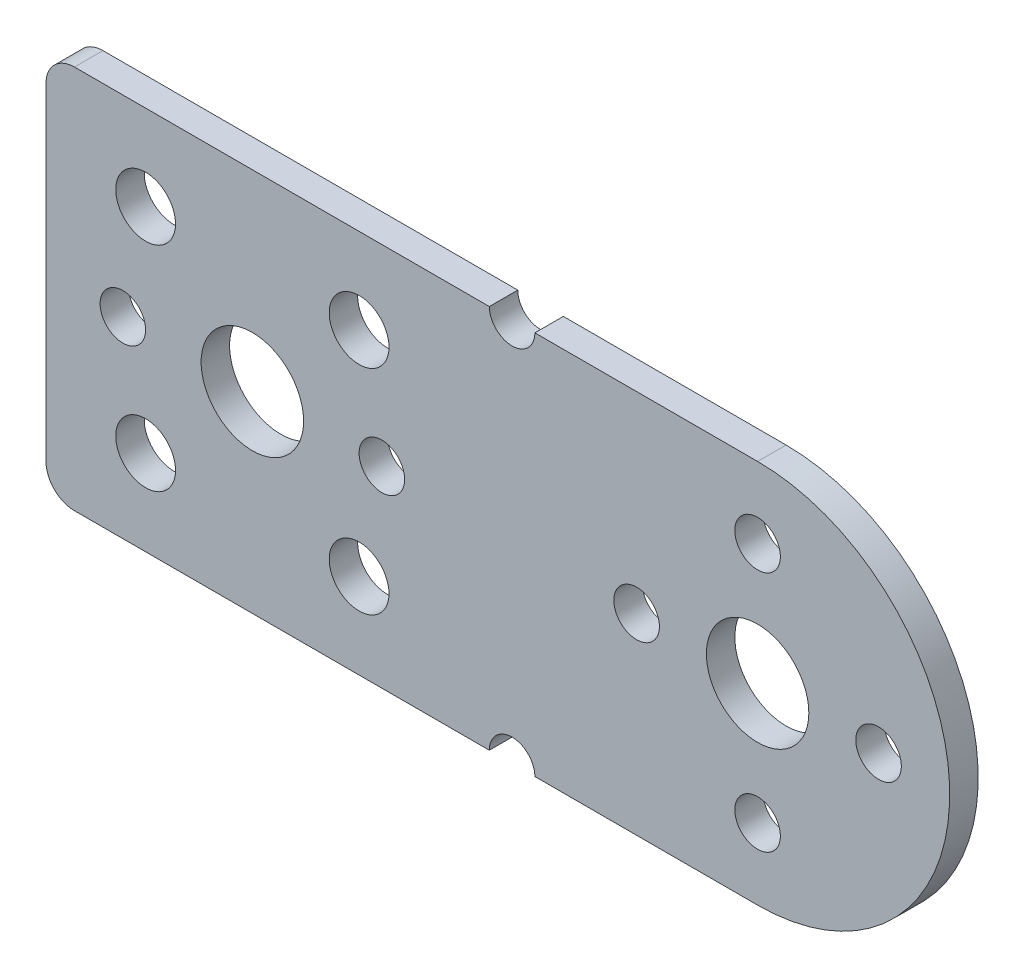
ISO-10303-21;
HEADER;
FILE_DESCRIPTION(('STEP AP214'),'2;1');
FILE_NAME('part.step','',(''),(''),'','','');
FILE_SCHEMA(('AUTOMOTIVE_DESIGN { 1 0 10303 214 1 1 1 1 }'));
ENDSEC;
DATA;
#1=APPLICATION_CONTEXT('core data for automotive mechanical design processes');
#2=APPLICATION_PROTOCOL_DEFINITION('international standard','automotive_design',2000,#1);
#3=PRODUCT_CONTEXT('',#1,'mechanical');
#4=PRODUCT('Part','Part','',(#3));
#5=PRODUCT_RELATED_PRODUCT_CATEGORY('part','',(#4));
#6=PRODUCT_DEFINITION_FORMATION('','',#4);
#7=PRODUCT_DEFINITION_CONTEXT('part definition',#1,'design');
#8=PRODUCT_DEFINITION('design','',#6,#7);
#9=PRODUCT_DEFINITION_SHAPE('','',#8);
#10=(LENGTH_UNIT() NAMED_UNIT(*) SI_UNIT(.MILLI.,.METRE.));
#11=(NAMED_UNIT(*) PLANE_ANGLE_UNIT() SI_UNIT($,.RADIAN.));
#12=(NAMED_UNIT(*) SI_UNIT($,.STERADIAN.) SOLID_ANGLE_UNIT());
#13=UNCERTAINTY_MEASURE_WITH_UNIT(LENGTH_MEASURE(1.E-05),#10,'distance_accuracy_value','');
#14=(GEOMETRIC_REPRESENTATION_CONTEXT(3) GLOBAL_UNCERTAINTY_ASSIGNED_CONTEXT((#13)) GLOBAL_UNIT_ASSIGNED_CONTEXT((#10,
#11,#12)) REPRESENTATION_CONTEXT('',''));
#15=CARTESIAN_POINT('',(0.,0.,0.));
#16=DIRECTION('',(0.,0.,1.));
#17=DIRECTION('',(1.,0.,0.));
#18=AXIS2_PLACEMENT_3D('',#15,#16,#17);
#19=CARTESIAN_POINT('',(31.75,13.5,0.));
#20=DIRECTION('',(0.,0.,1.));
#21=DIRECTION('',(1.,0.,0.));
#22=AXIS2_PLACEMENT_3D('',#19,#20,#21);
#23=PLANE('',#22);
#24=CARTESIAN_POINT('',(50.,13.5,0.));
#25=DIRECTION('',(0.,0.,-1.));
#26=DIRECTION('',(-1.,0.,0.));
#27=AXIS2_PLACEMENT_3D('',#24,#25,#26);
#28=CIRCLE('',#27,3.6);
#29=CARTESIAN_POINT('',(53.6,13.5,0.));
#30=VERTEX_POINT('',#29);
#31=EDGE_CURVE('E492',#30,#30,#28,.T.);
#32=ORIENTED_EDGE('',*,*,#31,.F.);
#33=EDGE_LOOP('',(#32));
#34=FACE_BOUND('',#33,.T.);
#35=CARTESIAN_POINT('',(58.5,13.5,0.));
#36=DIRECTION('',(0.,0.,-1.));
#37=DIRECTION('',(-1.,0.,0.));
#38=AXIS2_PLACEMENT_3D('',#35,#36,#37);
#39=CIRCLE('',#38,1.6);
#40=CARTESIAN_POINT('',(60.1,13.5,0.));
#41=VERTEX_POINT('',#40);
#42=EDGE_CURVE('E223',#41,#41,#39,.T.);
#43=ORIENTED_EDGE('',*,*,#42,.F.);
#44=EDGE_LOOP('',(#43));
#45=FACE_BOUND('',#44,.T.);
#46=CARTESIAN_POINT('',(50.,22.,0.));
#47=DIRECTION('',(0.,0.,-1.));
#48=DIRECTION('',(-1.,0.,0.));
#49=AXIS2_PLACEMENT_3D('',#46,#47,#48);
#50=CIRCLE('',#49,1.6);
#51=CARTESIAN_POINT('',(51.6,22.,0.));
#52=VERTEX_POINT('',#51);
#53=EDGE_CURVE('E217',#52,#52,#50,.T.);
#54=ORIENTED_EDGE('',*,*,#53,.F.);
#55=EDGE_LOOP('',(#54));
#56=FACE_BOUND('',#55,.T.);
#57=CARTESIAN_POINT('',(41.5,13.5,0.));
#58=DIRECTION('',(0.,0.,-1.));
#59=DIRECTION('',(-1.,0.,0.));
#60=AXIS2_PLACEMENT_3D('',#57,#58,#59);
#61=CIRCLE('',#60,1.6);
#62=CARTESIAN_POINT('',(43.1,13.5,0.));
#63=VERTEX_POINT('',#62);
#64=EDGE_CURVE('E259',#63,#63,#61,.T.);
#65=ORIENTED_EDGE('',*,*,#64,.F.);
#66=EDGE_LOOP('',(#65));
#67=FACE_BOUND('',#66,.T.);
#68=CARTESIAN_POINT('',(50.,5.,0.));
#69=DIRECTION('',(0.,0.,-1.));
#70=DIRECTION('',(-1.,0.,0.));
#71=AXIS2_PLACEMENT_3D('',#68,#69,#70);
#72=CIRCLE('',#71,1.6);
#73=CARTESIAN_POINT('',(51.6,5.,0.));
#74=VERTEX_POINT('',#73);
#75=EDGE_CURVE('E269',#74,#74,#72,.T.);
#76=ORIENTED_EDGE('',*,*,#75,.F.);
#77=EDGE_LOOP('',(#76));
#78=FACE_BOUND('',#77,.T.);
#79=CARTESIAN_POINT('',(23.6,13.5,0.));
#80=DIRECTION('',(0.,0.,-1.));
#81=DIRECTION('',(-1.,0.,0.));
#82=AXIS2_PLACEMENT_3D('',#79,#80,#81);
#83=CIRCLE('',#82,1.6);
#84=CARTESIAN_POINT('',(25.2,13.5,0.));
#85=VERTEX_POINT('',#84);
#86=EDGE_CURVE('E286',#85,#85,#83,.T.);
#87=ORIENTED_EDGE('',*,*,#86,.F.);
#88=EDGE_LOOP('',(#87));
#89=FACE_BOUND('',#88,.T.);
#90=CARTESIAN_POINT('',(5.4,13.5,0.));
#91=DIRECTION('',(0.,0.,-1.));
#92=DIRECTION('',(-1.,0.,0.));
#93=AXIS2_PLACEMENT_3D('',#90,#91,#92);
#94=CIRCLE('',#93,1.6);
#95=CARTESIAN_POINT('',(7.,13.5,0.));
#96=VERTEX_POINT('',#95);
#97=EDGE_CURVE('E303',#96,#96,#94,.T.);
#98=ORIENTED_EDGE('',*,*,#97,.F.);
#99=EDGE_LOOP('',(#98));
#100=FACE_BOUND('',#99,.T.);
#101=CARTESIAN_POINT('',(22.,21.,0.));
#102=DIRECTION('',(0.,0.,-1.));
#103=DIRECTION('',(-1.,0.,0.));
#104=AXIS2_PLACEMENT_3D('',#101,#102,#103);
#105=CIRCLE('',#104,2.1);
#106=CARTESIAN_POINT('',(24.1,21.,0.));
#107=VERTEX_POINT('',#106);
#108=EDGE_CURVE('E321',#107,#107,#105,.T.);
#109=ORIENTED_EDGE('',*,*,#108,.F.);
#110=EDGE_LOOP('',(#109));
#111=FACE_BOUND('',#110,.T.);
#112=CARTESIAN_POINT('',(22.,6.,0.));
#113=DIRECTION('',(0.,0.,-1.));
#114=DIRECTION('',(-1.,0.,0.));
#115=AXIS2_PLACEMENT_3D('',#112,#113,#114);
#116=CIRCLE('',#115,2.1);
#117=CARTESIAN_POINT('',(24.1,6.,0.));
#118=VERTEX_POINT('',#117);
#119=EDGE_CURVE('E331',#118,#118,#116,.T.);
#120=ORIENTED_EDGE('',*,*,#119,.F.);
#121=EDGE_LOOP('',(#120));
#122=FACE_BOUND('',#121,.T.);
#123=CARTESIAN_POINT('',(7.,6.,0.));
#124=DIRECTION('',(0.,0.,-1.));
#125=DIRECTION('',(-1.,0.,0.));
#126=AXIS2_PLACEMENT_3D('',#123,#124,#125);
#127=CIRCLE('',#126,2.1);
#128=CARTESIAN_POINT('',(9.1,6.,0.));
#129=VERTEX_POINT('',#128);
#130=EDGE_CURVE('E356',#129,#129,#127,.T.);
#131=ORIENTED_EDGE('',*,*,#130,.F.);
#132=EDGE_LOOP('',(#131));
#133=FACE_BOUND('',#132,.T.);
#134=CARTESIAN_POINT('',(7.,21.,0.));
#135=DIRECTION('',(0.,0.,-1.));
#136=DIRECTION('',(-1.,0.,0.));
#137=AXIS2_PLACEMENT_3D('',#134,#135,#136);
#138=CIRCLE('',#137,2.1);
#139=CARTESIAN_POINT('',(9.1,21.,0.));
#140=VERTEX_POINT('',#139);
#141=EDGE_CURVE('E243',#140,#140,#138,.T.);
#142=ORIENTED_EDGE('',*,*,#141,.F.);
#143=EDGE_LOOP('',(#142));
#144=FACE_BOUND('',#143,.T.);
#145=CARTESIAN_POINT('',(14.5,13.5,0.));
#146=DIRECTION('',(0.,0.,-1.));
#147=DIRECTION('',(-1.,0.,0.));
#148=AXIS2_PLACEMENT_3D('',#145,#146,#147);
#149=CIRCLE('',#148,3.6);
#150=CARTESIAN_POINT('',(18.1,13.5,0.));
#151=VERTEX_POINT('',#150);
#152=EDGE_CURVE('E374',#151,#151,#149,.T.);
#153=ORIENTED_EDGE('',*,*,#152,.F.);
#154=EDGE_LOOP('',(#153));
#155=FACE_BOUND('',#154,.T.);
#156=DIRECTION('',(-1.,0.,0.));
#157=VECTOR('',#156,1.);
#158=CARTESIAN_POINT('',(63.5,27.,0.));
#159=LINE('',#158,#157);
#160=CARTESIAN_POINT('',(50.,27.,0.));
#161=VERTEX_POINT('',#160);
#162=CARTESIAN_POINT('',(34.35,27.,0.));
#163=VERTEX_POINT('',#162);
#164=EDGE_CURVE('E25',#161,#163,#159,.T.);
#165=ORIENTED_EDGE('',*,*,#164,.F.);
#166=CARTESIAN_POINT('',(50.,13.5,0.));
#167=DIRECTION('',(0.,0.,1.));
#168=DIRECTION('',(1.,0.,0.));
#169=AXIS2_PLACEMENT_3D('',#166,#167,#168);
#170=CIRCLE('',#169,13.5);
#171=CARTESIAN_POINT('',(50.,0.,0.));
#172=VERTEX_POINT('',#171);
#173=EDGE_CURVE('E376',#172,#161,#170,.T.);
#174=ORIENTED_EDGE('',*,*,#173,.F.);
#175=DIRECTION('',(1.,0.,0.));
#176=VECTOR('',#175,1.);
#177=CARTESIAN_POINT('',(2.,0.,0.));
#178=LINE('',#177,#176);
#179=CARTESIAN_POINT('',(34.35,0.,0.));
#180=VERTEX_POINT('',#179);
#181=EDGE_CURVE('E297',#180,#172,#178,.T.);
#182=ORIENTED_EDGE('',*,*,#181,.F.);
#183=CARTESIAN_POINT('',(32.75,0.,0.));
#184=DIRECTION('',(0.,0.,-1.));
#185=DIRECTION('',(-1.,0.,0.));
#186=AXIS2_PLACEMENT_3D('',#183,#184,#185);
#187=CIRCLE('',#186,1.6);
#188=CARTESIAN_POINT('',(31.15,0.,0.));
#189=VERTEX_POINT('',#188);
#190=EDGE_CURVE('E386',#189,#180,#187,.T.);
#191=ORIENTED_EDGE('',*,*,#190,.F.);
#192=DIRECTION('',(1.,0.,0.));
#193=VECTOR('',#192,1.);
#194=CARTESIAN_POINT('',(2.,0.,0.));
#195=LINE('',#194,#193);
#196=CARTESIAN_POINT('',(2.,0.,0.));
#197=VERTEX_POINT('',#196);
#198=EDGE_CURVE('E397',#197,#189,#195,.T.);
#199=ORIENTED_EDGE('',*,*,#198,.F.);
#200=CARTESIAN_POINT('',(2.,2.,0.));
#201=DIRECTION('',(0.,0.,1.));
#202=DIRECTION('',(-1.,0.,0.));
#203=AXIS2_PLACEMENT_3D('',#200,#201,#202);
#204=CIRCLE('',#203,2.);
#205=CARTESIAN_POINT('',(0.,2.,0.));
#206=VERTEX_POINT('',#205);
#207=EDGE_CURVE('E406',#206,#197,#204,.T.);
#208=ORIENTED_EDGE('',*,*,#207,.F.);
#209=DIRECTION('',(0.,-1.,0.));
#210=VECTOR('',#209,1.);
#211=CARTESIAN_POINT('',(0.,25.,0.));
#212=LINE('',#211,#210);
#213=CARTESIAN_POINT('',(0.,25.,0.));
#214=VERTEX_POINT('',#213);
#215=EDGE_CURVE('E268',#214,#206,#212,.T.);
#216=ORIENTED_EDGE('',*,*,#215,.F.);
#217=CARTESIAN_POINT('',(2.,25.,0.));
#218=DIRECTION('',(0.,0.,1.));
#219=DIRECTION('',(0.,1.,0.));
#220=AXIS2_PLACEMENT_3D('',#217,#218,#219);
#221=CIRCLE('',#220,2.);
#222=CARTESIAN_POINT('',(2.,27.,0.));
#223=VERTEX_POINT('',#222);
#224=EDGE_CURVE('E247',#223,#214,#221,.T.);
#225=ORIENTED_EDGE('',*,*,#224,.F.);
#226=DIRECTION('',(-1.,0.,0.));
#227=VECTOR('',#226,1.);
#228=CARTESIAN_POINT('',(63.5,27.,0.));
#229=LINE('',#228,#227);
#230=CARTESIAN_POINT('',(31.15,27.,0.));
#231=VERTEX_POINT('',#230);
#232=EDGE_CURVE('E338',#231,#223,#229,.T.);
#233=ORIENTED_EDGE('',*,*,#232,.F.);
#234=CARTESIAN_POINT('',(32.75,27.,0.));
#235=DIRECTION('',(0.,0.,-1.));
#236=DIRECTION('',(-1.,0.,0.));
#237=AXIS2_PLACEMENT_3D('',#234,#235,#236);
#238=CIRCLE('',#237,1.6);
#239=EDGE_CURVE('E371',#163,#231,#238,.T.);
#240=ORIENTED_EDGE('',*,*,#239,.F.);
#241=EDGE_LOOP('',(#165,#174,#182,#191,#199,#208,#216,#225,#233,#240));
#242=FACE_BOUND('',#241,.T.);
#243=ADVANCED_FACE('F17',(#34,#45,#56,#67,#78,#89,#100,#111,#122,#133,#144,#155,#242),#23,.F.);
#244=CARTESIAN_POINT('',(31.75,13.5,2.));
#245=DIRECTION('',(0.,0.,1.));
#246=DIRECTION('',(1.,0.,0.));
#247=AXIS2_PLACEMENT_3D('',#244,#245,#246);
#248=PLANE('',#247);
#249=CARTESIAN_POINT('',(50.,13.5,2.));
#250=DIRECTION('',(0.,0.,-1.));
#251=DIRECTION('',(-1.,0.,0.));
#252=AXIS2_PLACEMENT_3D('',#249,#250,#251);
#253=CIRCLE('',#252,3.6);
#254=CARTESIAN_POINT('',(53.6,13.5,2.));
#255=VERTEX_POINT('',#254);
#256=EDGE_CURVE('E915',#255,#255,#253,.T.);
#257=ORIENTED_EDGE('',*,*,#256,.T.);
#258=EDGE_LOOP('',(#257));
#259=FACE_BOUND('',#258,.T.);
#260=CARTESIAN_POINT('',(58.5,13.5,2.));
#261=DIRECTION('',(0.,0.,-1.));
#262=DIRECTION('',(-1.,0.,0.));
#263=AXIS2_PLACEMENT_3D('',#260,#261,#262);
#264=CIRCLE('',#263,1.6);
#265=CARTESIAN_POINT('',(60.1,13.5,2.));
#266=VERTEX_POINT('',#265);
#267=EDGE_CURVE('E234',#266,#266,#264,.T.);
#268=ORIENTED_EDGE('',*,*,#267,.T.);
#269=EDGE_LOOP('',(#268));
#270=FACE_BOUND('',#269,.T.);
#271=CARTESIAN_POINT('',(50.,22.,2.));
#272=DIRECTION('',(0.,0.,-1.));
#273=DIRECTION('',(-1.,0.,0.));
#274=AXIS2_PLACEMENT_3D('',#271,#272,#273);
#275=CIRCLE('',#274,1.6);
#276=CARTESIAN_POINT('',(51.6,22.,2.));
#277=VERTEX_POINT('',#276);
#278=EDGE_CURVE('E216',#277,#277,#275,.T.);
#279=ORIENTED_EDGE('',*,*,#278,.T.);
#280=EDGE_LOOP('',(#279));
#281=FACE_BOUND('',#280,.T.);
#282=CARTESIAN_POINT('',(41.5,13.5,2.));
#283=DIRECTION('',(0.,0.,-1.));
#284=DIRECTION('',(-1.,0.,0.));
#285=AXIS2_PLACEMENT_3D('',#282,#283,#284);
#286=CIRCLE('',#285,1.6);
#287=CARTESIAN_POINT('',(43.1,13.5,2.));
#288=VERTEX_POINT('',#287);
#289=EDGE_CURVE('E248',#288,#288,#286,.T.);
#290=ORIENTED_EDGE('',*,*,#289,.T.);
#291=EDGE_LOOP('',(#290));
#292=FACE_BOUND('',#291,.T.);
#293=CARTESIAN_POINT('',(50.,5.,2.));
#294=DIRECTION('',(0.,0.,-1.));
#295=DIRECTION('',(-1.,0.,0.));
#296=AXIS2_PLACEMENT_3D('',#293,#294,#295);
#297=CIRCLE('',#296,1.6);
#298=CARTESIAN_POINT('',(51.6,5.,2.));
#299=VERTEX_POINT('',#298);
#300=EDGE_CURVE('E255',#299,#299,#297,.T.);
#301=ORIENTED_EDGE('',*,*,#300,.T.);
#302=EDGE_LOOP('',(#301));
#303=FACE_BOUND('',#302,.T.);
#304=CARTESIAN_POINT('',(23.6,13.5,2.));
#305=DIRECTION('',(0.,0.,-1.));
#306=DIRECTION('',(-1.,0.,0.));
#307=AXIS2_PLACEMENT_3D('',#304,#305,#306);
#308=CIRCLE('',#307,1.6);
#309=CARTESIAN_POINT('',(25.2,13.5,2.));
#310=VERTEX_POINT('',#309);
#311=EDGE_CURVE('E272',#310,#310,#308,.T.);
#312=ORIENTED_EDGE('',*,*,#311,.T.);
#313=EDGE_LOOP('',(#312));
#314=FACE_BOUND('',#313,.T.);
#315=CARTESIAN_POINT('',(5.4,13.5,2.));
#316=DIRECTION('',(0.,0.,-1.));
#317=DIRECTION('',(-1.,0.,0.));
#318=AXIS2_PLACEMENT_3D('',#315,#316,#317);
#319=CIRCLE('',#318,1.6);
#320=CARTESIAN_POINT('',(7.,13.5,2.));
#321=VERTEX_POINT('',#320);
#322=EDGE_CURVE('E287',#321,#321,#319,.T.);
#323=ORIENTED_EDGE('',*,*,#322,.T.);
#324=EDGE_LOOP('',(#323));
#325=FACE_BOUND('',#324,.T.);
#326=CARTESIAN_POINT('',(22.,21.,2.));
#327=DIRECTION('',(0.,0.,-1.));
#328=DIRECTION('',(-1.,0.,0.));
#329=AXIS2_PLACEMENT_3D('',#326,#327,#328);
#330=CIRCLE('',#329,2.1);
#331=CARTESIAN_POINT('',(24.1,21.,2.));
#332=VERTEX_POINT('',#331);
#333=EDGE_CURVE('E308',#332,#332,#330,.T.);
#334=ORIENTED_EDGE('',*,*,#333,.T.);
#335=EDGE_LOOP('',(#334));
#336=FACE_BOUND('',#335,.T.);
#337=CARTESIAN_POINT('',(22.,6.,2.));
#338=DIRECTION('',(0.,0.,-1.));
#339=DIRECTION('',(-1.,0.,0.));
#340=AXIS2_PLACEMENT_3D('',#337,#338,#339);
#341=CIRCLE('',#340,2.1);
#342=CARTESIAN_POINT('',(24.1,6.,2.));
#343=VERTEX_POINT('',#342);
#344=EDGE_CURVE('E322',#343,#343,#341,.T.);
#345=ORIENTED_EDGE('',*,*,#344,.T.);
#346=EDGE_LOOP('',(#345));
#347=FACE_BOUND('',#346,.T.);
#348=CARTESIAN_POINT('',(7.,6.,2.));
#349=DIRECTION('',(0.,0.,-1.));
#350=DIRECTION('',(-1.,0.,0.));
#351=AXIS2_PLACEMENT_3D('',#348,#349,#350);
#352=CIRCLE('',#351,2.1);
#353=CARTESIAN_POINT('',(9.1,6.,2.));
#354=VERTEX_POINT('',#353);
#355=EDGE_CURVE('E345',#354,#354,#352,.T.);
#356=ORIENTED_EDGE('',*,*,#355,.T.);
#357=EDGE_LOOP('',(#356));
#358=FACE_BOUND('',#357,.T.);
#359=CARTESIAN_POINT('',(7.,21.,2.));
#360=DIRECTION('',(0.,0.,-1.));
#361=DIRECTION('',(-1.,0.,0.));
#362=AXIS2_PLACEMENT_3D('',#359,#360,#361);
#363=CIRCLE('',#362,2.1);
#364=CARTESIAN_POINT('',(9.1,21.,2.));
#365=VERTEX_POINT('',#364);
#366=EDGE_CURVE('E244',#365,#365,#363,.T.);
#367=ORIENTED_EDGE('',*,*,#366,.T.);
#368=EDGE_LOOP('',(#367));
#369=FACE_BOUND('',#368,.T.);
#370=CARTESIAN_POINT('',(14.5,13.5,2.));
#371=DIRECTION('',(0.,0.,-1.));
#372=DIRECTION('',(-1.,0.,0.));
#373=AXIS2_PLACEMENT_3D('',#370,#371,#372);
#374=CIRCLE('',#373,3.6);
#375=CARTESIAN_POINT('',(18.1,13.5,2.));
#376=VERTEX_POINT('',#375);
#377=EDGE_CURVE('E365',#376,#376,#374,.T.);
#378=ORIENTED_EDGE('',*,*,#377,.T.);
#379=EDGE_LOOP('',(#378));
#380=FACE_BOUND('',#379,.T.);
#381=DIRECTION('',(-1.,0.,0.));
#382=VECTOR('',#381,1.);
#383=CARTESIAN_POINT('',(63.5,27.,2.));
#384=LINE('',#383,#382);
#385=CARTESIAN_POINT('',(50.,27.,2.));
#386=VERTEX_POINT('',#385);
#387=CARTESIAN_POINT('',(34.35,27.,2.));
#388=VERTEX_POINT('',#387);
#389=EDGE_CURVE('E11',#386,#388,#384,.T.);
#390=ORIENTED_EDGE('',*,*,#389,.T.);
#391=CARTESIAN_POINT('',(32.75,27.,2.));
#392=DIRECTION('',(0.,0.,-1.));
#393=DIRECTION('',(-1.,0.,0.));
#394=AXIS2_PLACEMENT_3D('',#391,#392,#393);
#395=CIRCLE('',#394,1.6);
#396=CARTESIAN_POINT('',(31.15,27.,2.));
#397=VERTEX_POINT('',#396);
#398=EDGE_CURVE('E355',#388,#397,#395,.T.);
#399=ORIENTED_EDGE('',*,*,#398,.T.);
#400=DIRECTION('',(-1.,0.,0.));
#401=VECTOR('',#400,1.);
#402=CARTESIAN_POINT('',(63.5,27.,2.));
#403=LINE('',#402,#401);
#404=CARTESIAN_POINT('',(2.,27.,2.));
#405=VERTEX_POINT('',#404);
#406=EDGE_CURVE('E419',#397,#405,#403,.T.);
#407=ORIENTED_EDGE('',*,*,#406,.T.);
#408=CARTESIAN_POINT('',(2.,25.,2.));
#409=DIRECTION('',(0.,0.,1.));
#410=DIRECTION('',(0.,1.,0.));
#411=AXIS2_PLACEMENT_3D('',#408,#409,#410);
#412=CIRCLE('',#411,2.);
#413=CARTESIAN_POINT('',(0.,25.,2.));
#414=VERTEX_POINT('',#413);
#415=EDGE_CURVE('E252',#405,#414,#412,.T.);
#416=ORIENTED_EDGE('',*,*,#415,.T.);
#417=DIRECTION('',(0.,-1.,0.));
#418=VECTOR('',#417,1.);
#419=CARTESIAN_POINT('',(0.,25.,2.));
#420=LINE('',#419,#418);
#421=CARTESIAN_POINT('',(0.,2.,2.));
#422=VERTEX_POINT('',#421);
#423=EDGE_CURVE('E344',#414,#422,#420,.T.);
#424=ORIENTED_EDGE('',*,*,#423,.T.);
#425=CARTESIAN_POINT('',(2.,2.,2.));
#426=DIRECTION('',(0.,0.,1.));
#427=DIRECTION('',(-1.,0.,0.));
#428=AXIS2_PLACEMENT_3D('',#425,#426,#427);
#429=CIRCLE('',#428,2.);
#430=CARTESIAN_POINT('',(2.,0.,2.));
#431=VERTEX_POINT('',#430);
#432=EDGE_CURVE('E267',#422,#431,#429,.T.);
#433=ORIENTED_EDGE('',*,*,#432,.T.);
#434=DIRECTION('',(1.,0.,0.));
#435=VECTOR('',#434,1.);
#436=CARTESIAN_POINT('',(2.,0.,2.));
#437=LINE('',#436,#435);
#438=CARTESIAN_POINT('',(31.15,0.,2.));
#439=VERTEX_POINT('',#438);
#440=EDGE_CURVE('E401',#431,#439,#437,.T.);
#441=ORIENTED_EDGE('',*,*,#440,.T.);
#442=CARTESIAN_POINT('',(32.75,0.,2.));
#443=DIRECTION('',(0.,0.,-1.));
#444=DIRECTION('',(-1.,0.,0.));
#445=AXIS2_PLACEMENT_3D('',#442,#443,#444);
#446=CIRCLE('',#445,1.6);
#447=CARTESIAN_POINT('',(34.35,0.,2.));
#448=VERTEX_POINT('',#447);
#449=EDGE_CURVE('E392',#439,#448,#446,.T.);
#450=ORIENTED_EDGE('',*,*,#449,.T.);
#451=DIRECTION('',(1.,0.,0.));
#452=VECTOR('',#451,1.);
#453=CARTESIAN_POINT('',(2.,0.,2.));
#454=LINE('',#453,#452);
#455=CARTESIAN_POINT('',(50.,0.,2.));
#456=VERTEX_POINT('',#455);
#457=EDGE_CURVE('E314',#448,#456,#454,.T.);
#458=ORIENTED_EDGE('',*,*,#457,.T.);
#459=CARTESIAN_POINT('',(50.,13.5,2.));
#460=DIRECTION('',(0.,0.,1.));
#461=DIRECTION('',(1.,0.,0.));
#462=AXIS2_PLACEMENT_3D('',#459,#460,#461);
#463=CIRCLE('',#462,13.5);
#464=EDGE_CURVE('E298',#456,#386,#463,.T.);
#465=ORIENTED_EDGE('',*,*,#464,.T.);
#466=EDGE_LOOP('',(#390,#399,#407,#416,#424,#433,#441,#450,#458,#465));
#467=FACE_BOUND('',#466,.T.);
#468=ADVANCED_FACE('F225',(#259,#270,#281,#292,#303,#314,#325,#336,#347,#358,#369,#380,#467),
#248,.T.);
#469=CARTESIAN_POINT('',(50.,27.,0.));
#470=DIRECTION('',(0.,1.,0.));
#471=DIRECTION('',(1.,0.,0.));
#472=AXIS2_PLACEMENT_3D('',#469,#470,#471);
#473=PLANE('',#472);
#474=ORIENTED_EDGE('',*,*,#164,.T.);
#475=DIRECTION('',(0.,0.,1.));
#476=VECTOR('',#475,1.);
#477=CARTESIAN_POINT('',(34.35,27.,0.));
#478=LINE('',#477,#476);
#479=EDGE_CURVE('E310',#163,#388,#478,.T.);
#480=ORIENTED_EDGE('',*,*,#479,.T.);
#481=ORIENTED_EDGE('',*,*,#389,.F.);
#482=DIRECTION('',(0.,0.,1.));
#483=VECTOR('',#482,1.);
#484=CARTESIAN_POINT('',(50.,27.,0.));
#485=LINE('',#484,#483);
#486=EDGE_CURVE('E379',#161,#386,#485,.T.);
#487=ORIENTED_EDGE('',*,*,#486,.F.);
#488=EDGE_LOOP('',(#474,#480,#481,#487));
#489=FACE_BOUND('',#488,.T.);
#490=ADVANCED_FACE('F480',(#489),#473,.T.);
#491=CARTESIAN_POINT('',(32.75,27.,0.));
#492=DIRECTION('',(0.,0.,1.));
#493=DIRECTION('',(-1.,0.,0.));
#494=AXIS2_PLACEMENT_3D('',#491,#492,#493);
#495=CYLINDRICAL_SURFACE('',#494,1.6);
#496=ORIENTED_EDGE('',*,*,#239,.T.);
#497=DIRECTION('',(0.,0.,1.));
#498=VECTOR('',#497,1.);
#499=CARTESIAN_POINT('',(31.15,27.,0.));
#500=LINE('',#499,#498);
#501=EDGE_CURVE('E421',#231,#397,#500,.T.);
#502=ORIENTED_EDGE('',*,*,#501,.T.);
#503=ORIENTED_EDGE('',*,*,#398,.F.);
#504=ORIENTED_EDGE('',*,*,#479,.F.);
#505=EDGE_LOOP('',(#496,#502,#503,#504));
#506=FACE_BOUND('',#505,.T.);
#507=ADVANCED_FACE('F435',(#506),#495,.F.);
#508=CARTESIAN_POINT('',(31.15,27.,0.));
#509=DIRECTION('',(0.,1.,0.));
#510=DIRECTION('',(1.,0.,0.));
#511=AXIS2_PLACEMENT_3D('',#508,#509,#510);
#512=PLANE('',#511);
#513=ORIENTED_EDGE('',*,*,#232,.T.);
#514=DIRECTION('',(0.,0.,1.));
#515=VECTOR('',#514,1.);
#516=CARTESIAN_POINT('',(2.,27.,0.));
#517=LINE('',#516,#515);
#518=EDGE_CURVE('E333',#223,#405,#517,.T.);
#519=ORIENTED_EDGE('',*,*,#518,.T.);
#520=ORIENTED_EDGE('',*,*,#406,.F.);
#521=ORIENTED_EDGE('',*,*,#501,.F.);
#522=EDGE_LOOP('',(#513,#519,#520,#521));
#523=FACE_BOUND('',#522,.T.);
#524=ADVANCED_FACE('F437',(#523),#512,.T.);
#525=CARTESIAN_POINT('',(2.,25.,0.));
#526=DIRECTION('',(0.,0.,1.));
#527=DIRECTION('',(0.,1.,0.));
#528=AXIS2_PLACEMENT_3D('',#525,#526,#527);
#529=CYLINDRICAL_SURFACE('',#528,2.);
#530=ORIENTED_EDGE('',*,*,#224,.T.);
#531=DIRECTION('',(0.,0.,1.));
#532=VECTOR('',#531,1.);
#533=CARTESIAN_POINT('',(0.,25.,0.));
#534=LINE('',#533,#532);
#535=EDGE_CURVE('E251',#214,#414,#534,.T.);
#536=ORIENTED_EDGE('',*,*,#535,.T.);
#537=ORIENTED_EDGE('',*,*,#415,.F.);
#538=ORIENTED_EDGE('',*,*,#518,.F.);
#539=EDGE_LOOP('',(#530,#536,#537,#538));
#540=FACE_BOUND('',#539,.T.);
#541=ADVANCED_FACE('F443',(#540),#529,.T.);
#542=CARTESIAN_POINT('',(0.,25.,0.));
#543=DIRECTION('',(-1.,0.,0.));
#544=DIRECTION('',(0.,1.,0.));
#545=AXIS2_PLACEMENT_3D('',#542,#543,#544);
#546=PLANE('',#545);
#547=ORIENTED_EDGE('',*,*,#215,.T.);
#548=DIRECTION('',(0.,0.,1.));
#549=VECTOR('',#548,1.);
#550=CARTESIAN_POINT('',(0.,2.,0.));
#551=LINE('',#550,#549);
#552=EDGE_CURVE('E262',#206,#422,#551,.T.);
#553=ORIENTED_EDGE('',*,*,#552,.T.);
#554=ORIENTED_EDGE('',*,*,#423,.F.);
#555=ORIENTED_EDGE('',*,*,#535,.F.);
#556=EDGE_LOOP('',(#547,#553,#554,#555));
#557=FACE_BOUND('',#556,.T.);
#558=ADVANCED_FACE('F448',(#557),#546,.T.);
#559=CARTESIAN_POINT('',(2.,2.,0.));
#560=DIRECTION('',(0.,0.,1.));
#561=DIRECTION('',(-1.,0.,0.));
#562=AXIS2_PLACEMENT_3D('',#559,#560,#561);
#563=CYLINDRICAL_SURFACE('',#562,2.);
#564=ORIENTED_EDGE('',*,*,#207,.T.);
#565=DIRECTION('',(0.,0.,1.));
#566=VECTOR('',#565,1.);
#567=CARTESIAN_POINT('',(2.,0.,0.));
#568=LINE('',#567,#566);
#569=EDGE_CURVE('E404',#197,#431,#568,.T.);
#570=ORIENTED_EDGE('',*,*,#569,.T.);
#571=ORIENTED_EDGE('',*,*,#432,.F.);
#572=ORIENTED_EDGE('',*,*,#552,.F.);
#573=EDGE_LOOP('',(#564,#570,#571,#572));
#574=FACE_BOUND('',#573,.T.);
#575=ADVANCED_FACE('F460',(#574),#563,.T.);
#576=CARTESIAN_POINT('',(2.,0.,0.));
#577=DIRECTION('',(0.,-1.,0.));
#578=DIRECTION('',(-1.,0.,0.));
#579=AXIS2_PLACEMENT_3D('',#576,#577,#578);
#580=PLANE('',#579);
#581=ORIENTED_EDGE('',*,*,#198,.T.);
#582=DIRECTION('',(0.,0.,1.));
#583=VECTOR('',#582,1.);
#584=CARTESIAN_POINT('',(31.15,0.,0.));
#585=LINE('',#584,#583);
#586=EDGE_CURVE('E395',#189,#439,#585,.T.);
#587=ORIENTED_EDGE('',*,*,#586,.T.);
#588=ORIENTED_EDGE('',*,*,#440,.F.);
#589=ORIENTED_EDGE('',*,*,#569,.F.);
#590=EDGE_LOOP('',(#581,#587,#588,#589));
#591=FACE_BOUND('',#590,.T.);
#592=ADVANCED_FACE('F461',(#591),#580,.T.);
#593=CARTESIAN_POINT('',(32.75,0.,0.));
#594=DIRECTION('',(0.,0.,1.));
#595=DIRECTION('',(-1.,0.,0.));
#596=AXIS2_PLACEMENT_3D('',#593,#594,#595);
#597=CYLINDRICAL_SURFACE('',#596,1.6);
#598=ORIENTED_EDGE('',*,*,#190,.T.);
#599=DIRECTION('',(0.,0.,1.));
#600=VECTOR('',#599,1.);
#601=CARTESIAN_POINT('',(34.35,0.,0.));
#602=LINE('',#601,#600);
#603=EDGE_CURVE('E320',#180,#448,#602,.T.);
#604=ORIENTED_EDGE('',*,*,#603,.T.);
#605=ORIENTED_EDGE('',*,*,#449,.F.);
#606=ORIENTED_EDGE('',*,*,#586,.F.);
#607=EDGE_LOOP('',(#598,#604,#605,#606));
#608=FACE_BOUND('',#607,.T.);
#609=ADVANCED_FACE('F466',(#608),#597,.F.);
#610=CARTESIAN_POINT('',(34.35,0.,0.));
#611=DIRECTION('',(0.,-1.,0.));
#612=DIRECTION('',(-1.,0.,0.));
#613=AXIS2_PLACEMENT_3D('',#610,#611,#612);
#614=PLANE('',#613);
#615=ORIENTED_EDGE('',*,*,#181,.T.);
#616=DIRECTION('',(0.,0.,1.));
#617=VECTOR('',#616,1.);
#618=CARTESIAN_POINT('',(50.,0.,0.));
#619=LINE('',#618,#617);
#620=EDGE_CURVE('E292',#172,#456,#619,.T.);
#621=ORIENTED_EDGE('',*,*,#620,.T.);
#622=ORIENTED_EDGE('',*,*,#457,.F.);
#623=ORIENTED_EDGE('',*,*,#603,.F.);
#624=EDGE_LOOP('',(#615,#621,#622,#623));
#625=FACE_BOUND('',#624,.T.);
#626=ADVANCED_FACE('F472',(#625),#614,.T.);
#627=CARTESIAN_POINT('',(50.,13.5,0.));
#628=DIRECTION('',(0.,0.,1.));
#629=DIRECTION('',(1.,0.,0.));
#630=AXIS2_PLACEMENT_3D('',#627,#628,#629);
#631=CYLINDRICAL_SURFACE('',#630,13.5);
#632=ORIENTED_EDGE('',*,*,#173,.T.);
#633=ORIENTED_EDGE('',*,*,#486,.T.);
#634=ORIENTED_EDGE('',*,*,#464,.F.);
#635=ORIENTED_EDGE('',*,*,#620,.F.);
#636=EDGE_LOOP('',(#632,#633,#634,#635));
#637=FACE_BOUND('',#636,.T.);
#638=ADVANCED_FACE('F478',(#637),#631,.T.);
#639=CARTESIAN_POINT('',(14.5,13.5,0.));
#640=DIRECTION('',(0.,0.,1.));
#641=DIRECTION('',(-1.,0.,0.));
#642=AXIS2_PLACEMENT_3D('',#639,#640,#641);
#643=CYLINDRICAL_SURFACE('',#642,3.6);
#644=ORIENTED_EDGE('',*,*,#377,.F.);
#645=DIRECTION('',(0.,0.,-1.));
#646=VECTOR('',#645,1.);
#647=CARTESIAN_POINT('',(18.1,13.5,0.));
#648=LINE('',#647,#646);
#649=EDGE_CURVE('E366',#376,#151,#648,.T.);
#650=ORIENTED_EDGE('',*,*,#649,.T.);
#651=ORIENTED_EDGE('',*,*,#152,.T.);
#652=ORIENTED_EDGE('',*,*,#649,.F.);
#653=EDGE_LOOP('',(#644,#650,#651,#652));
#654=FACE_BOUND('',#653,.T.);
#655=ADVANCED_FACE('F517',(#654),#643,.F.);
#656=CARTESIAN_POINT('',(7.,21.,0.));
#657=DIRECTION('',(0.,0.,1.));
#658=DIRECTION('',(-1.,0.,0.));
#659=AXIS2_PLACEMENT_3D('',#656,#657,#658);
#660=CYLINDRICAL_SURFACE('',#659,2.1);
#661=ORIENTED_EDGE('',*,*,#366,.F.);
#662=DIRECTION('',(0.,0.,-1.));
#663=VECTOR('',#662,1.);
#664=CARTESIAN_POINT('',(9.1,21.,0.));
#665=LINE('',#664,#663);
#666=EDGE_CURVE('E239',#365,#140,#665,.T.);
#667=ORIENTED_EDGE('',*,*,#666,.T.);
#668=ORIENTED_EDGE('',*,*,#141,.T.);
#669=ORIENTED_EDGE('',*,*,#666,.F.);
#670=EDGE_LOOP('',(#661,#667,#668,#669));
#671=FACE_BOUND('',#670,.T.);
#672=ADVANCED_FACE('F521',(#671),#660,.F.);
#673=CARTESIAN_POINT('',(7.,6.,0.));
#674=DIRECTION('',(0.,0.,1.));
#675=DIRECTION('',(-1.,0.,0.));
#676=AXIS2_PLACEMENT_3D('',#673,#674,#675);
#677=CYLINDRICAL_SURFACE('',#676,2.1);
#678=ORIENTED_EDGE('',*,*,#355,.F.);
#679=DIRECTION('',(0.,0.,-1.));
#680=VECTOR('',#679,1.);
#681=CARTESIAN_POINT('',(9.1,6.,0.));
#682=LINE('',#681,#680);
#683=EDGE_CURVE('E347',#354,#129,#682,.T.);
#684=ORIENTED_EDGE('',*,*,#683,.T.);
#685=ORIENTED_EDGE('',*,*,#130,.T.);
#686=ORIENTED_EDGE('',*,*,#683,.F.);
#687=EDGE_LOOP('',(#678,#684,#685,#686));
#688=FACE_BOUND('',#687,.T.);
#689=ADVANCED_FACE('F527',(#688),#677,.F.);
#690=CARTESIAN_POINT('',(22.,6.,0.));
#691=DIRECTION('',(0.,0.,1.));
#692=DIRECTION('',(-1.,0.,0.));
#693=AXIS2_PLACEMENT_3D('',#690,#691,#692);
#694=CYLINDRICAL_SURFACE('',#693,2.1);
#695=ORIENTED_EDGE('',*,*,#344,.F.);
#696=DIRECTION('',(0.,0.,-1.));
#697=VECTOR('',#696,1.);
#698=CARTESIAN_POINT('',(24.1,6.,0.));
#699=LINE('',#698,#697);
#700=EDGE_CURVE('E327',#343,#118,#699,.T.);
#701=ORIENTED_EDGE('',*,*,#700,.T.);
#702=ORIENTED_EDGE('',*,*,#119,.T.);
#703=ORIENTED_EDGE('',*,*,#700,.F.);
#704=EDGE_LOOP('',(#695,#701,#702,#703));
#705=FACE_BOUND('',#704,.T.);
#706=ADVANCED_FACE('F532',(#705),#694,.F.);
#707=CARTESIAN_POINT('',(22.,21.,0.));
#708=DIRECTION('',(0.,0.,1.));
#709=DIRECTION('',(-1.,0.,0.));
#710=AXIS2_PLACEMENT_3D('',#707,#708,#709);
#711=CYLINDRICAL_SURFACE('',#710,2.1);
#712=ORIENTED_EDGE('',*,*,#333,.F.);
#713=DIRECTION('',(0.,0.,-1.));
#714=VECTOR('',#713,1.);
#715=CARTESIAN_POINT('',(24.1,21.,0.));
#716=LINE('',#715,#714);
#717=EDGE_CURVE('E311',#332,#107,#716,.T.);
#718=ORIENTED_EDGE('',*,*,#717,.T.);
#719=ORIENTED_EDGE('',*,*,#108,.T.);
#720=ORIENTED_EDGE('',*,*,#717,.F.);
#721=EDGE_LOOP('',(#712,#718,#719,#720));
#722=FACE_BOUND('',#721,.T.);
#723=ADVANCED_FACE('F531',(#722),#711,.F.);
#724=CARTESIAN_POINT('',(5.4,13.5,0.));
#725=DIRECTION('',(0.,0.,1.));
#726=DIRECTION('',(-1.,0.,0.));
#727=AXIS2_PLACEMENT_3D('',#724,#725,#726);
#728=CYLINDRICAL_SURFACE('',#727,1.6);
#729=ORIENTED_EDGE('',*,*,#322,.F.);
#730=DIRECTION('',(0.,0.,-1.));
#731=VECTOR('',#730,1.);
#732=CARTESIAN_POINT('',(7.,13.5,0.));
#733=LINE('',#732,#731);
#734=EDGE_CURVE('E293',#321,#96,#733,.T.);
#735=ORIENTED_EDGE('',*,*,#734,.T.);
#736=ORIENTED_EDGE('',*,*,#97,.T.);
#737=ORIENTED_EDGE('',*,*,#734,.F.);
#738=EDGE_LOOP('',(#729,#735,#736,#737));
#739=FACE_BOUND('',#738,.T.);
#740=ADVANCED_FACE('F638',(#739),#728,.F.);
#741=CARTESIAN_POINT('',(23.6,13.5,0.));
#742=DIRECTION('',(0.,0.,1.));
#743=DIRECTION('',(-1.,0.,0.));
#744=AXIS2_PLACEMENT_3D('',#741,#742,#743);
#745=CYLINDRICAL_SURFACE('',#744,1.6);
#746=ORIENTED_EDGE('',*,*,#311,.F.);
#747=DIRECTION('',(0.,0.,-1.));
#748=VECTOR('',#747,1.);
#749=CARTESIAN_POINT('',(25.2,13.5,0.));
#750=LINE('',#749,#748);
#751=EDGE_CURVE('E276',#310,#85,#750,.T.);
#752=ORIENTED_EDGE('',*,*,#751,.T.);
#753=ORIENTED_EDGE('',*,*,#86,.T.);
#754=ORIENTED_EDGE('',*,*,#751,.F.);
#755=EDGE_LOOP('',(#746,#752,#753,#754));
#756=FACE_BOUND('',#755,.T.);
#757=ADVANCED_FACE('F646',(#756),#745,.F.);
#758=CARTESIAN_POINT('',(50.,5.,0.));
#759=DIRECTION('',(0.,0.,1.));
#760=DIRECTION('',(-1.,0.,0.));
#761=AXIS2_PLACEMENT_3D('',#758,#759,#760);
#762=CYLINDRICAL_SURFACE('',#761,1.6);
#763=ORIENTED_EDGE('',*,*,#300,.F.);
#764=DIRECTION('',(0.,0.,-1.));
#765=VECTOR('',#764,1.);
#766=CARTESIAN_POINT('',(51.6,5.,0.));
#767=LINE('',#766,#765);
#768=EDGE_CURVE('E256',#299,#74,#767,.T.);
#769=ORIENTED_EDGE('',*,*,#768,.T.);
#770=ORIENTED_EDGE('',*,*,#75,.T.);
#771=ORIENTED_EDGE('',*,*,#768,.F.);
#772=EDGE_LOOP('',(#763,#769,#770,#771));
#773=FACE_BOUND('',#772,.T.);
#774=ADVANCED_FACE('F656',(#773),#762,.F.);
#775=CARTESIAN_POINT('',(41.5,13.5,0.));
#776=DIRECTION('',(0.,0.,1.));
#777=DIRECTION('',(-1.,0.,0.));
#778=AXIS2_PLACEMENT_3D('',#775,#776,#777);
#779=CYLINDRICAL_SURFACE('',#778,1.6);
#780=ORIENTED_EDGE('',*,*,#289,.F.);
#781=DIRECTION('',(0.,0.,-1.));
#782=VECTOR('',#781,1.);
#783=CARTESIAN_POINT('',(43.1,13.5,0.));
#784=LINE('',#783,#782);
#785=EDGE_CURVE('E257',#288,#63,#784,.T.);
#786=ORIENTED_EDGE('',*,*,#785,.T.);
#787=ORIENTED_EDGE('',*,*,#64,.T.);
#788=ORIENTED_EDGE('',*,*,#785,.F.);
#789=EDGE_LOOP('',(#780,#786,#787,#788));
#790=FACE_BOUND('',#789,.T.);
#791=ADVANCED_FACE('F667',(#790),#779,.F.);
#792=CARTESIAN_POINT('',(50.,22.,0.));
#793=DIRECTION('',(0.,0.,1.));
#794=DIRECTION('',(-1.,0.,0.));
#795=AXIS2_PLACEMENT_3D('',#792,#793,#794);
#796=CYLINDRICAL_SURFACE('',#795,1.6);
#797=ORIENTED_EDGE('',*,*,#278,.F.);
#798=DIRECTION('',(0.,0.,-1.));
#799=VECTOR('',#798,1.);
#800=CARTESIAN_POINT('',(51.6,22.,0.));
#801=LINE('',#800,#799);
#802=EDGE_CURVE('E213',#277,#52,#801,.T.);
#803=ORIENTED_EDGE('',*,*,#802,.T.);
#804=ORIENTED_EDGE('',*,*,#53,.T.);
#805=ORIENTED_EDGE('',*,*,#802,.F.);
#806=EDGE_LOOP('',(#797,#803,#804,#805));
#807=FACE_BOUND('',#806,.T.);
#808=ADVANCED_FACE('F214',(#807),#796,.F.);
#809=CARTESIAN_POINT('',(58.5,13.5,0.));
#810=DIRECTION('',(0.,0.,1.));
#811=DIRECTION('',(-1.,0.,0.));
#812=AXIS2_PLACEMENT_3D('',#809,#810,#811);
#813=CYLINDRICAL_SURFACE('',#812,1.6);
#814=ORIENTED_EDGE('',*,*,#267,.F.);
#815=DIRECTION('',(0.,0.,-1.));
#816=VECTOR('',#815,1.);
#817=CARTESIAN_POINT('',(60.1,13.5,0.));
#818=LINE('',#817,#816);
#819=EDGE_CURVE('E231',#266,#41,#818,.T.);
#820=ORIENTED_EDGE('',*,*,#819,.T.);
#821=ORIENTED_EDGE('',*,*,#42,.T.);
#822=ORIENTED_EDGE('',*,*,#819,.F.);
#823=EDGE_LOOP('',(#814,#820,#821,#822));
#824=FACE_BOUND('',#823,.T.);
#825=ADVANCED_FACE('F687',(#824),#813,.F.);
#826=CARTESIAN_POINT('',(50.,13.5,0.));
#827=DIRECTION('',(0.,0.,1.));
#828=DIRECTION('',(-1.,0.,0.));
#829=AXIS2_PLACEMENT_3D('',#826,#827,#828);
#830=CYLINDRICAL_SURFACE('',#829,3.6);
#831=ORIENTED_EDGE('',*,*,#256,.F.);
#832=DIRECTION('',(0.,0.,-1.));
#833=VECTOR('',#832,1.);
#834=CARTESIAN_POINT('',(53.6,13.5,0.));
#835=LINE('',#834,#833);
#836=EDGE_CURVE('E902',#255,#30,#835,.T.);
#837=ORIENTED_EDGE('',*,*,#836,.T.);
#838=ORIENTED_EDGE('',*,*,#31,.T.);
#839=ORIENTED_EDGE('',*,*,#836,.F.);
#840=EDGE_LOOP('',(#831,#837,#838,#839));
#841=FACE_BOUND('',#840,.T.);
#842=ADVANCED_FACE('F696',(#841),#830,.F.);
#843=CLOSED_SHELL('',(#243,#468,#490,#507,#524,#541,#558,#575,#592,#609,#626,#638,#655,#672,
#689,#706,#723,#740,#757,#774,#791,#808,#825,#842));
#844=MANIFOLD_SOLID_BREP('B1',#843);
#845=ADVANCED_BREP_SHAPE_REPRESENTATION('',(#18,#844),#14);
#846=SHAPE_DEFINITION_REPRESENTATION(#9,#845);
ENDSEC;
END-ISO-10303-21;
